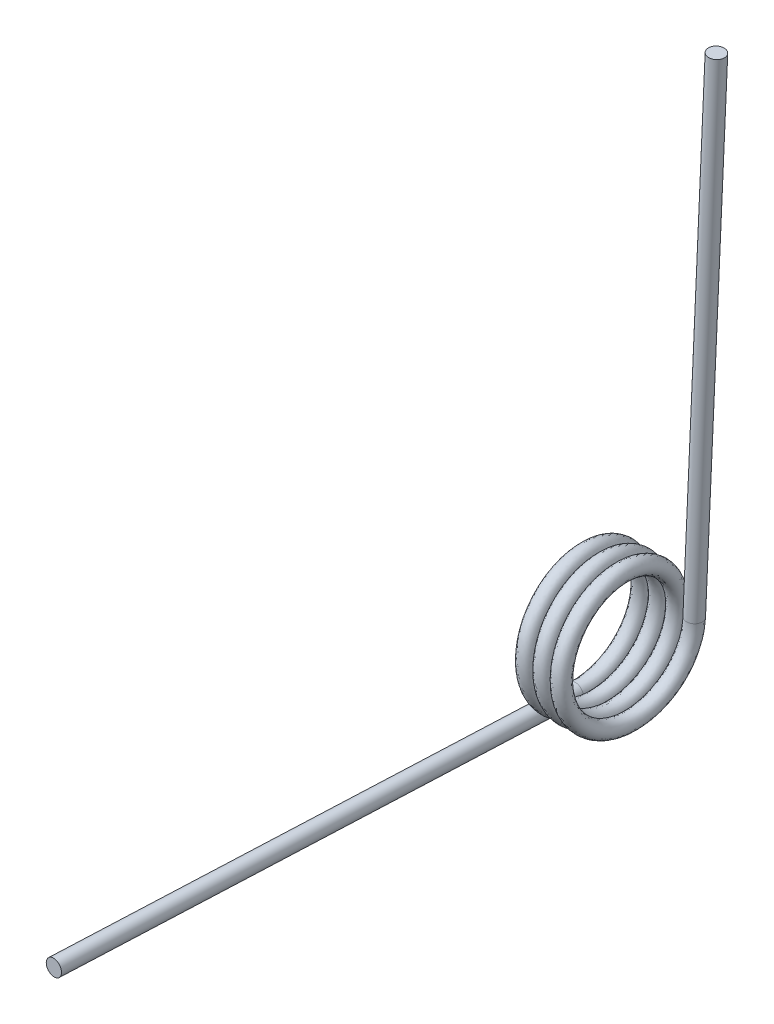
ISO-10303-21;
HEADER;
FILE_DESCRIPTION(('STEP AP214'),'2;1');
FILE_NAME('part.step','',(''),(''),'','','');
FILE_SCHEMA(('AUTOMOTIVE_DESIGN { 1 0 10303 214 1 1 1 1 }'));
ENDSEC;
DATA;
#1=APPLICATION_CONTEXT('core data for automotive mechanical design processes');
#2=APPLICATION_PROTOCOL_DEFINITION('international standard','automotive_design',2000,#1);
#3=PRODUCT_CONTEXT('',#1,'mechanical');
#4=PRODUCT('Part','Part','',(#3));
#5=PRODUCT_RELATED_PRODUCT_CATEGORY('part','',(#4));
#6=PRODUCT_DEFINITION_FORMATION('','',#4);
#7=PRODUCT_DEFINITION_CONTEXT('part definition',#1,'design');
#8=PRODUCT_DEFINITION('design','',#6,#7);
#9=PRODUCT_DEFINITION_SHAPE('','',#8);
#10=(LENGTH_UNIT() NAMED_UNIT(*) SI_UNIT(.MILLI.,.METRE.));
#11=(NAMED_UNIT(*) PLANE_ANGLE_UNIT() SI_UNIT($,.RADIAN.));
#12=(NAMED_UNIT(*) SI_UNIT($,.STERADIAN.) SOLID_ANGLE_UNIT());
#13=UNCERTAINTY_MEASURE_WITH_UNIT(LENGTH_MEASURE(1.E-05),#10,'distance_accuracy_value','');
#14=(GEOMETRIC_REPRESENTATION_CONTEXT(3) GLOBAL_UNCERTAINTY_ASSIGNED_CONTEXT((#13)) GLOBAL_UNIT_ASSIGNED_CONTEXT((#10,
#11,#12)) REPRESENTATION_CONTEXT('',''));
#15=CARTESIAN_POINT('',(0.,0.,0.));
#16=DIRECTION('',(0.,0.,1.));
#17=DIRECTION('',(1.,0.,0.));
#18=AXIS2_PLACEMENT_3D('',#15,#16,#17);
#19=CARTESIAN_POINT('',(-0.152249362965953,-1.1811,-0.006774324797477));
#20=CARTESIAN_POINT('',(-0.124732696299286,-1.1771888417546,-0.688682727737344));
#21=CARTESIAN_POINT('',(-0.0972160296326196,-0.584683262631898,-1.02624976680854));
#22=CARTESIAN_POINT('',(-0.069699362965953,0.00782231649080252,-1.36381680587973));
#23=CARTESIAN_POINT('',(-0.0421826962992864,0.596416737368102,-1.01947544201106));
#24=CARTESIAN_POINT('',(-0.0146660296326198,1.1850111582454,-0.675134078142391));
#25=CARTESIAN_POINT('',(0.0128506370340468,1.1811,0.00677432479747685));
#26=CARTESIAN_POINT('',(0.0403673037007134,1.1771888417546,0.688682727737344));
#27=CARTESIAN_POINT('',(0.06788397036738,0.584683262631899,1.02624976680854));
#28=CARTESIAN_POINT('',(0.0954006370340467,-0.00782231649080235,1.36381680587973));
#29=CARTESIAN_POINT('',(0.122917303700713,-0.596416737368101,1.01947544201106));
#30=CARTESIAN_POINT('',(0.15043397036738,-1.1850111582454,0.675134078142391));
#31=CARTESIAN_POINT('',(0.177950637034046,-1.1811,-0.006774324797477));
#32=CARTESIAN_POINT('',(0.205467303700713,-1.1771888417546,-0.688682727737344));
#33=CARTESIAN_POINT('',(0.23298397036738,-0.584683262631898,-1.02624976680854));
#34=CARTESIAN_POINT('',(0.260500637034046,0.00782231649080252,-1.36381680587973));
#35=CARTESIAN_POINT('',(0.288017303700713,0.596416737368102,-1.01947544201106));
#36=CARTESIAN_POINT('',(0.315533970367379,1.1850111582454,-0.675134078142391));
#37=CARTESIAN_POINT('',(0.343050637034046,1.1811,0.00677432479747685));
#38=CARTESIAN_POINT('',(0.370567303700713,1.1771888417546,0.688682727737344));
#39=CARTESIAN_POINT('',(0.398083970367379,0.584683262631899,1.02624976680854));
#40=CARTESIAN_POINT('',(0.425600637034046,-0.00782231649080235,1.36381680587973));
#41=CARTESIAN_POINT('',(0.453117303700712,-0.596416737368101,1.01947544201106));
#42=CARTESIAN_POINT('',(0.480633970367379,-1.1850111582454,0.675134078142391));
#43=CARTESIAN_POINT('',(0.508150637034046,-1.1811,-0.006774324797477));
#44=CARTESIAN_POINT('',(0.535667303700712,-1.1771888417546,-0.688682727737344));
#45=CARTESIAN_POINT('',(0.563183970367379,-0.584683262631898,-1.02624976680854));
#46=CARTESIAN_POINT('',(0.590700637034046,0.00782231649080252,-1.36381680587973));
#47=CARTESIAN_POINT('',(0.618217303700712,0.596416737368102,-1.01947544201106));
#48=CARTESIAN_POINT('',(0.645733970367379,1.1850111582454,-0.675134078142391));
#49=CARTESIAN_POINT('',(0.673250637034045,1.1811,0.00677432479747685));
#50=CARTESIAN_POINT('',(0.700767303700712,1.1771888417546,0.688682727737344));
#51=CARTESIAN_POINT('',(0.728283970367378,0.584683262631899,1.02624976680854));
#52=CARTESIAN_POINT('',(0.755800637034045,-0.00782231649080235,1.36381680587973));
#53=CARTESIAN_POINT('',(0.783317303700712,-0.596416737368101,1.01947544201106));
#54=CARTESIAN_POINT('',(0.810833970367378,-1.1850111582454,0.675134078142391));
#55=CARTESIAN_POINT('',(0.838350637034045,-1.1811,-0.006774324797477));
#56=CARTESIAN_POINT('',(0.865867303700712,-1.1771888417546,-0.688682727737344));
#57=CARTESIAN_POINT('',(0.893383970367378,-0.584683262631898,-1.02624976680854));
#58=CARTESIAN_POINT('',(0.920900637034045,0.00782231649080252,-1.36381680587973));
#59=CARTESIAN_POINT('',(0.948417303700711,0.596416737368102,-1.01947544201106));
#60=CARTESIAN_POINT('',(0.975933970367378,1.1850111582454,-0.675134078142391));
#61=CARTESIAN_POINT('',(1.00345063703404,1.1811,0.00677432479747685));
#62=CARTESIAN_POINT('',(1.03096730370071,1.1771888417546,0.688682727737344));
#63=CARTESIAN_POINT('',(1.05848397036738,0.584683262631899,1.02624976680854));
#64=CARTESIAN_POINT('',(1.08600063703404,-0.00782231649080235,1.36381680587973));
#65=CARTESIAN_POINT('',(1.11351730370071,-0.596416737368101,1.01947544201106));
#66=CARTESIAN_POINT('',(1.14103397036738,-1.1850111582454,0.675134078142391));
#67=CARTESIAN_POINT('',(1.16855063703404,-1.1811,-0.006774324797477));
#68=CARTESIAN_POINT('',(-0.152249362965953,-0.8763,-0.00677432479747363));
#69=CARTESIAN_POINT('',(-0.124732696299286,-0.872388841754601,-0.512706365688343));
#70=CARTESIAN_POINT('',(-0.0972160296326197,-0.432283262631901,-0.762285223735041));
#71=CARTESIAN_POINT('',(-0.0696993629659531,0.00782231649079865,-1.01186408178174));
#72=CARTESIAN_POINT('',(-0.0421826962992865,0.444016737368099,-0.755510898937567));
#73=CARTESIAN_POINT('',(-0.0146660296326199,0.8802111582454,-0.499157716093396));
#74=CARTESIAN_POINT('',(0.0128506370340467,0.8763,0.00677432479747352));
#75=CARTESIAN_POINT('',(0.0403673037007133,0.872388841754601,0.512706365688343));
#76=CARTESIAN_POINT('',(0.0678839703673799,0.432283262631902,0.762285223735041));
#77=CARTESIAN_POINT('',(0.0954006370340465,-0.00782231649079853,1.01186408178174));
#78=CARTESIAN_POINT('',(0.122917303700713,-0.444016737368099,0.755510898937568));
#79=CARTESIAN_POINT('',(0.15043397036738,-0.8802111582454,0.499157716093396));
#80=CARTESIAN_POINT('',(0.177950637034046,-0.8763,-0.00677432479747363));
#81=CARTESIAN_POINT('',(0.205467303700713,-0.872388841754601,-0.512706365688343));
#82=CARTESIAN_POINT('',(0.23298397036738,-0.432283262631901,-0.762285223735041));
#83=CARTESIAN_POINT('',(0.260500637034046,0.00782231649079865,-1.01186408178174));
#84=CARTESIAN_POINT('',(0.288017303700713,0.444016737368099,-0.755510898937567));
#85=CARTESIAN_POINT('',(0.315533970367379,0.8802111582454,-0.499157716093396));
#86=CARTESIAN_POINT('',(0.343050637034046,0.8763,0.00677432479747352));
#87=CARTESIAN_POINT('',(0.370567303700713,0.872388841754601,0.512706365688343));
#88=CARTESIAN_POINT('',(0.398083970367379,0.432283262631902,0.762285223735041));
#89=CARTESIAN_POINT('',(0.425600637034046,-0.00782231649079853,1.01186408178174));
#90=CARTESIAN_POINT('',(0.453117303700712,-0.444016737368099,0.755510898937568));
#91=CARTESIAN_POINT('',(0.480633970367379,-0.8802111582454,0.499157716093396));
#92=CARTESIAN_POINT('',(0.508150637034046,-0.8763,-0.00677432479747363));
#93=CARTESIAN_POINT('',(0.535667303700712,-0.872388841754601,-0.512706365688343));
#94=CARTESIAN_POINT('',(0.563183970367379,-0.432283262631901,-0.762285223735041));
#95=CARTESIAN_POINT('',(0.590700637034045,0.00782231649079865,-1.01186408178174));
#96=CARTESIAN_POINT('',(0.618217303700712,0.444016737368099,-0.755510898937567));
#97=CARTESIAN_POINT('',(0.645733970367379,0.8802111582454,-0.499157716093396));
#98=CARTESIAN_POINT('',(0.673250637034045,0.8763,0.00677432479747352));
#99=CARTESIAN_POINT('',(0.700767303700712,0.872388841754601,0.512706365688343));
#100=CARTESIAN_POINT('',(0.728283970367378,0.432283262631902,0.762285223735041));
#101=CARTESIAN_POINT('',(0.755800637034045,-0.00782231649079853,1.01186408178174));
#102=CARTESIAN_POINT('',(0.783317303700711,-0.444016737368099,0.755510898937568));
#103=CARTESIAN_POINT('',(0.810833970367378,-0.8802111582454,0.499157716093396));
#104=CARTESIAN_POINT('',(0.838350637034045,-0.8763,-0.00677432479747363));
#105=CARTESIAN_POINT('',(0.865867303700711,-0.872388841754601,-0.512706365688343));
#106=CARTESIAN_POINT('',(0.893383970367378,-0.432283262631901,-0.762285223735041));
#107=CARTESIAN_POINT('',(0.920900637034045,0.00782231649079865,-1.01186408178174));
#108=CARTESIAN_POINT('',(0.948417303700711,0.444016737368099,-0.755510898937567));
#109=CARTESIAN_POINT('',(0.975933970367378,0.8802111582454,-0.499157716093396));
#110=CARTESIAN_POINT('',(1.00345063703404,0.8763,0.00677432479747352));
#111=CARTESIAN_POINT('',(1.03096730370071,0.872388841754601,0.512706365688343));
#112=CARTESIAN_POINT('',(1.05848397036738,0.432283262631902,0.762285223735041));
#113=CARTESIAN_POINT('',(1.08600063703404,-0.00782231649079853,1.01186408178174));
#114=CARTESIAN_POINT('',(1.11351730370071,-0.444016737368099,0.755510898937568));
#115=CARTESIAN_POINT('',(1.14103397036738,-0.8802111582454,0.499157716093396));
#116=CARTESIAN_POINT('',(1.16855063703404,-0.8763,-0.00677432479747363));
#117=CARTESIAN_POINT('',(0.152249362965953,-0.8763,0.00677432479745563));
#118=CARTESIAN_POINT('',(0.179766029632619,-0.88021115824539,-0.499157716093414));
#119=CARTESIAN_POINT('',(0.207282696299286,-0.444016737368084,-0.755510898937576));
#120=CARTESIAN_POINT('',(0.234799362965953,-0.00782231649077799,-1.01186408178174));
#121=CARTESIAN_POINT('',(0.262316029632619,0.432283262631917,-0.762285223735032));
#122=CARTESIAN_POINT('',(0.289832696299286,0.872388841754611,-0.512706365688325));
#123=CARTESIAN_POINT('',(0.317349362965952,0.8763,-0.00677432479745574));
#124=CARTESIAN_POINT('',(0.344866029632619,0.88021115824539,0.499157716093413));
#125=CARTESIAN_POINT('',(0.372382696299286,0.444016737368084,0.755510898937576));
#126=CARTESIAN_POINT('',(0.399899362965952,0.00782231649077812,1.01186408178174));
#127=CARTESIAN_POINT('',(0.427416029632619,-0.432283262631916,0.762285223735032));
#128=CARTESIAN_POINT('',(0.454932696299285,-0.872388841754611,0.512706365688326));
#129=CARTESIAN_POINT('',(0.482449362965952,-0.8763,0.00677432479745563));
#130=CARTESIAN_POINT('',(0.509966029632619,-0.88021115824539,-0.499157716093414));
#131=CARTESIAN_POINT('',(0.537482696299285,-0.444016737368084,-0.755510898937576));
#132=CARTESIAN_POINT('',(0.564999362965952,-0.00782231649077799,-1.01186408178174));
#133=CARTESIAN_POINT('',(0.592516029632618,0.432283262631917,-0.762285223735032));
#134=CARTESIAN_POINT('',(0.620032696299285,0.872388841754611,-0.512706365688325));
#135=CARTESIAN_POINT('',(0.647549362965952,0.8763,-0.00677432479745574));
#136=CARTESIAN_POINT('',(0.675066029632618,0.88021115824539,0.499157716093413));
#137=CARTESIAN_POINT('',(0.702582696299285,0.444016737368084,0.755510898937576));
#138=CARTESIAN_POINT('',(0.730099362965951,0.00782231649077812,1.01186408178174));
#139=CARTESIAN_POINT('',(0.757616029632618,-0.432283262631916,0.762285223735032));
#140=CARTESIAN_POINT('',(0.785132696299285,-0.872388841754611,0.512706365688326));
#141=CARTESIAN_POINT('',(0.812649362965951,-0.8763,0.00677432479745563));
#142=CARTESIAN_POINT('',(0.840166029632618,-0.88021115824539,-0.499157716093414));
#143=CARTESIAN_POINT('',(0.867682696299284,-0.444016737368084,-0.755510898937576));
#144=CARTESIAN_POINT('',(0.895199362965951,-0.00782231649077799,-1.01186408178174));
#145=CARTESIAN_POINT('',(0.922716029632617,0.432283262631917,-0.762285223735032));
#146=CARTESIAN_POINT('',(0.950232696299284,0.872388841754611,-0.512706365688325));
#147=CARTESIAN_POINT('',(0.977749362965951,0.8763,-0.00677432479745574));
#148=CARTESIAN_POINT('',(1.00526602963262,0.88021115824539,0.499157716093413));
#149=CARTESIAN_POINT('',(1.03278269629928,0.444016737368084,0.755510898937576));
#150=CARTESIAN_POINT('',(1.06029936296595,0.00782231649077812,1.01186408178174));
#151=CARTESIAN_POINT('',(1.08781602963262,-0.432283262631916,0.762285223735032));
#152=CARTESIAN_POINT('',(1.11533269629928,-0.872388841754611,0.512706365688326));
#153=CARTESIAN_POINT('',(1.14284936296595,-0.8763,0.00677432479745563));
#154=CARTESIAN_POINT('',(1.17036602963262,-0.88021115824539,-0.499157716093414));
#155=CARTESIAN_POINT('',(1.19788269629928,-0.444016737368084,-0.755510898937576));
#156=CARTESIAN_POINT('',(1.22539936296595,-0.00782231649077799,-1.01186408178174));
#157=CARTESIAN_POINT('',(1.25291602963262,0.432283262631917,-0.762285223735032));
#158=CARTESIAN_POINT('',(1.28043269629928,0.872388841754611,-0.512706365688325));
#159=CARTESIAN_POINT('',(1.30794936296595,0.8763,-0.00677432479745574));
#160=CARTESIAN_POINT('',(1.33546602963262,0.88021115824539,0.499157716093413));
#161=CARTESIAN_POINT('',(1.36298269629928,0.444016737368084,0.755510898937576));
#162=CARTESIAN_POINT('',(1.39049936296595,0.00782231649077812,1.01186408178174));
#163=CARTESIAN_POINT('',(1.41801602963262,-0.432283262631916,0.762285223735032));
#164=CARTESIAN_POINT('',(1.44553269629928,-0.872388841754611,0.512706365688326));
#165=CARTESIAN_POINT('',(1.47304936296595,-0.8763,0.00677432479745563));
#166=CARTESIAN_POINT('',(0.152249362965953,-1.1811,0.00677432479745226));
#167=CARTESIAN_POINT('',(0.17976602963262,-1.18501115824539,-0.675134078142415));
#168=CARTESIAN_POINT('',(0.207282696299286,-0.596416737368081,-1.01947544201107));
#169=CARTESIAN_POINT('',(0.234799362965953,-0.00782231649077412,-1.36381680587973));
#170=CARTESIAN_POINT('',(0.262316029632619,0.584683262631919,-1.02624976680853));
#171=CARTESIAN_POINT('',(0.289832696299286,1.17718884175461,-0.68868272773732));
#172=CARTESIAN_POINT('',(0.317349362965953,1.1811,-0.00677432479745241));
#173=CARTESIAN_POINT('',(0.344866029632619,1.18501115824539,0.675134078142414));
#174=CARTESIAN_POINT('',(0.372382696299286,0.596416737368081,1.01947544201107));
#175=CARTESIAN_POINT('',(0.399899362965952,0.00782231649077429,1.36381680587973));
#176=CARTESIAN_POINT('',(0.427416029632619,-0.584683262631919,1.02624976680853));
#177=CARTESIAN_POINT('',(0.454932696299286,-1.17718884175461,0.68868272773732));
#178=CARTESIAN_POINT('',(0.482449362965952,-1.1811,0.00677432479745226));
#179=CARTESIAN_POINT('',(0.509966029632619,-1.18501115824539,-0.675134078142415));
#180=CARTESIAN_POINT('',(0.537482696299285,-0.596416737368081,-1.01947544201107));
#181=CARTESIAN_POINT('',(0.564999362965952,-0.00782231649077412,-1.36381680587973));
#182=CARTESIAN_POINT('',(0.592516029632619,0.584683262631919,-1.02624976680853));
#183=CARTESIAN_POINT('',(0.620032696299285,1.17718884175461,-0.68868272773732));
#184=CARTESIAN_POINT('',(0.647549362965952,1.1811,-0.00677432479745241));
#185=CARTESIAN_POINT('',(0.675066029632618,1.18501115824539,0.675134078142414));
#186=CARTESIAN_POINT('',(0.702582696299285,0.596416737368081,1.01947544201107));
#187=CARTESIAN_POINT('',(0.730099362965952,0.00782231649077429,1.36381680587973));
#188=CARTESIAN_POINT('',(0.757616029632618,-0.584683262631919,1.02624976680853));
#189=CARTESIAN_POINT('',(0.785132696299285,-1.17718884175461,0.68868272773732));
#190=CARTESIAN_POINT('',(0.812649362965951,-1.1811,0.00677432479745226));
#191=CARTESIAN_POINT('',(0.840166029632618,-1.18501115824539,-0.675134078142415));
#192=CARTESIAN_POINT('',(0.867682696299285,-0.596416737368081,-1.01947544201107));
#193=CARTESIAN_POINT('',(0.895199362965951,-0.00782231649077412,-1.36381680587973));
#194=CARTESIAN_POINT('',(0.922716029632618,0.584683262631919,-1.02624976680853));
#195=CARTESIAN_POINT('',(0.950232696299284,1.17718884175461,-0.68868272773732));
#196=CARTESIAN_POINT('',(0.977749362965951,1.1811,-0.00677432479745241));
#197=CARTESIAN_POINT('',(1.00526602963262,1.18501115824539,0.675134078142414));
#198=CARTESIAN_POINT('',(1.03278269629928,0.596416737368081,1.01947544201107));
#199=CARTESIAN_POINT('',(1.06029936296595,0.00782231649077429,1.36381680587973));
#200=CARTESIAN_POINT('',(1.08781602963262,-0.584683262631919,1.02624976680853));
#201=CARTESIAN_POINT('',(1.11533269629928,-1.17718884175461,0.68868272773732));
#202=CARTESIAN_POINT('',(1.14284936296595,-1.1811,0.00677432479745226));
#203=CARTESIAN_POINT('',(1.17036602963262,-1.18501115824539,-0.675134078142415));
#204=CARTESIAN_POINT('',(1.19788269629928,-0.596416737368081,-1.01947544201107));
#205=CARTESIAN_POINT('',(1.22539936296595,-0.00782231649077412,-1.36381680587973));
#206=CARTESIAN_POINT('',(1.25291602963262,0.584683262631919,-1.02624976680853));
#207=CARTESIAN_POINT('',(1.28043269629928,1.17718884175461,-0.68868272773732));
#208=CARTESIAN_POINT('',(1.30794936296595,1.1811,-0.00677432479745241));
#209=CARTESIAN_POINT('',(1.33546602963262,1.18501115824539,0.675134078142414));
#210=CARTESIAN_POINT('',(1.36298269629928,0.596416737368081,1.01947544201107));
#211=CARTESIAN_POINT('',(1.39049936296595,0.00782231649077429,1.36381680587973));
#212=CARTESIAN_POINT('',(1.41801602963262,-0.584683262631919,1.02624976680853));
#213=CARTESIAN_POINT('',(1.44553269629928,-1.17718884175461,0.68868272773732));
#214=CARTESIAN_POINT('',(1.47304936296595,-1.1811,0.00677432479745226));
#215=CARTESIAN_POINT('',(0.152249362965953,-1.4859,0.00677432479744889));
#216=CARTESIAN_POINT('',(0.17976602963262,-1.48981115824539,-0.851110440191416));
#217=CARTESIAN_POINT('',(0.207282696299286,-0.748816737368078,-1.28343998508457));
#218=CARTESIAN_POINT('',(0.234799362965953,-0.00782231649077026,-1.71576952997773));
#219=CARTESIAN_POINT('',(0.26231602963262,0.737083262631922,-1.29021430988202));
#220=CARTESIAN_POINT('',(0.289832696299286,1.48198884175461,-0.864659089786314));
#221=CARTESIAN_POINT('',(0.317349362965953,1.4859,-0.00677432479744908));
#222=CARTESIAN_POINT('',(0.344866029632619,1.48981115824539,0.851110440191416));
#223=CARTESIAN_POINT('',(0.372382696299286,0.748816737368078,1.28343998508457));
#224=CARTESIAN_POINT('',(0.399899362965953,0.00782231649077047,1.71576952997773));
#225=CARTESIAN_POINT('',(0.427416029632619,-0.737083262631921,1.29021430988202));
#226=CARTESIAN_POINT('',(0.454932696299286,-1.48198884175461,0.864659089786315));
#227=CARTESIAN_POINT('',(0.482449362965952,-1.4859,0.00677432479744889));
#228=CARTESIAN_POINT('',(0.509966029632619,-1.48981115824539,-0.851110440191416));
#229=CARTESIAN_POINT('',(0.537482696299286,-0.748816737368078,-1.28343998508457));
#230=CARTESIAN_POINT('',(0.564999362965952,-0.00782231649077026,-1.71576952997773));
#231=CARTESIAN_POINT('',(0.592516029632619,0.737083262631922,-1.29021430988202));
#232=CARTESIAN_POINT('',(0.620032696299285,1.48198884175461,-0.864659089786314));
#233=CARTESIAN_POINT('',(0.647549362965952,1.4859,-0.00677432479744908));
#234=CARTESIAN_POINT('',(0.675066029632619,1.48981115824539,0.851110440191416));
#235=CARTESIAN_POINT('',(0.702582696299285,0.748816737368078,1.28343998508457));
#236=CARTESIAN_POINT('',(0.730099362965952,0.00782231649077047,1.71576952997773));
#237=CARTESIAN_POINT('',(0.757616029632618,-0.737083262631921,1.29021430988202));
#238=CARTESIAN_POINT('',(0.785132696299285,-1.48198884175461,0.864659089786315));
#239=CARTESIAN_POINT('',(0.812649362965952,-1.4859,0.00677432479744889));
#240=CARTESIAN_POINT('',(0.840166029632618,-1.48981115824539,-0.851110440191416));
#241=CARTESIAN_POINT('',(0.867682696299285,-0.748816737368078,-1.28343998508457));
#242=CARTESIAN_POINT('',(0.895199362965951,-0.00782231649077026,-1.71576952997773));
#243=CARTESIAN_POINT('',(0.922716029632618,0.737083262631922,-1.29021430988202));
#244=CARTESIAN_POINT('',(0.950232696299284,1.48198884175461,-0.864659089786314));
#245=CARTESIAN_POINT('',(0.977749362965951,1.4859,-0.00677432479744908));
#246=CARTESIAN_POINT('',(1.00526602963262,1.48981115824539,0.851110440191416));
#247=CARTESIAN_POINT('',(1.03278269629928,0.748816737368078,1.28343998508457));
#248=CARTESIAN_POINT('',(1.06029936296595,0.00782231649077047,1.71576952997773));
#249=CARTESIAN_POINT('',(1.08781602963262,-0.737083262631921,1.29021430988202));
#250=CARTESIAN_POINT('',(1.11533269629928,-1.48198884175461,0.864659089786315));
#251=CARTESIAN_POINT('',(1.14284936296595,-1.4859,0.00677432479744889));
#252=CARTESIAN_POINT('',(1.17036602963262,-1.48981115824539,-0.851110440191416));
#253=CARTESIAN_POINT('',(1.19788269629928,-0.748816737368078,-1.28343998508457));
#254=CARTESIAN_POINT('',(1.22539936296595,-0.00782231649077026,-1.71576952997773));
#255=CARTESIAN_POINT('',(1.25291602963262,0.737083262631922,-1.29021430988202));
#256=CARTESIAN_POINT('',(1.28043269629928,1.48198884175461,-0.864659089786314));
#257=CARTESIAN_POINT('',(1.30794936296595,1.4859,-0.00677432479744908));
#258=CARTESIAN_POINT('',(1.33546602963262,1.48981115824539,0.851110440191416));
#259=CARTESIAN_POINT('',(1.36298269629928,0.748816737368078,1.28343998508457));
#260=CARTESIAN_POINT('',(1.39049936296595,0.00782231649077047,1.71576952997773));
#261=CARTESIAN_POINT('',(1.41801602963262,-0.737083262631921,1.29021430988202));
#262=CARTESIAN_POINT('',(1.44553269629928,-1.48198884175461,0.864659089786315));
#263=CARTESIAN_POINT('',(1.47304936296595,-1.4859,0.00677432479744889));
#264=CARTESIAN_POINT('',(-0.152249362965953,-1.4859,-0.00677432479748037));
#265=CARTESIAN_POINT('',(-0.124732696299286,-1.4819888417546,-0.864659089786345));
#266=CARTESIAN_POINT('',(-0.0972160296326194,-0.737083262631895,-1.29021430988204));
#267=CARTESIAN_POINT('',(-0.0696993629659528,0.00782231649080639,-1.71576952997773));
#268=CARTESIAN_POINT('',(-0.0421826962992862,0.748816737368105,-1.28343998508456));
#269=CARTESIAN_POINT('',(-0.0146660296326196,1.4898111582454,-0.851110440191385));
#270=CARTESIAN_POINT('',(0.012850637034047,1.4859,0.00677432479748019));
#271=CARTESIAN_POINT('',(0.0403673037007136,1.4819888417546,0.864659089786345));
#272=CARTESIAN_POINT('',(0.0678839703673802,0.737083262631896,1.29021430988204));
#273=CARTESIAN_POINT('',(0.0954006370340468,-0.00782231649080618,1.71576952997773));
#274=CARTESIAN_POINT('',(0.122917303700713,-0.748816737368104,1.28343998508456));
#275=CARTESIAN_POINT('',(0.15043397036738,-1.4898111582454,0.851110440191385));
#276=CARTESIAN_POINT('',(0.177950637034047,-1.4859,-0.00677432479748037));
#277=CARTESIAN_POINT('',(0.205467303700713,-1.4819888417546,-0.864659089786345));
#278=CARTESIAN_POINT('',(0.23298397036738,-0.737083262631895,-1.29021430988204));
#279=CARTESIAN_POINT('',(0.260500637034046,0.00782231649080639,-1.71576952997773));
#280=CARTESIAN_POINT('',(0.288017303700713,0.748816737368105,-1.28343998508456));
#281=CARTESIAN_POINT('',(0.31553397036738,1.4898111582454,-0.851110440191385));
#282=CARTESIAN_POINT('',(0.343050637034046,1.4859,0.00677432479748019));
#283=CARTESIAN_POINT('',(0.370567303700713,1.4819888417546,0.864659089786345));
#284=CARTESIAN_POINT('',(0.398083970367379,0.737083262631896,1.29021430988204));
#285=CARTESIAN_POINT('',(0.425600637034046,-0.00782231649080618,1.71576952997773));
#286=CARTESIAN_POINT('',(0.453117303700713,-0.748816737368104,1.28343998508456));
#287=CARTESIAN_POINT('',(0.480633970367379,-1.4898111582454,0.851110440191385));
#288=CARTESIAN_POINT('',(0.508150637034046,-1.4859,-0.00677432479748037));
#289=CARTESIAN_POINT('',(0.535667303700713,-1.4819888417546,-0.864659089786345));
#290=CARTESIAN_POINT('',(0.563183970367379,-0.737083262631895,-1.29021430988204));
#291=CARTESIAN_POINT('',(0.590700637034046,0.00782231649080639,-1.71576952997773));
#292=CARTESIAN_POINT('',(0.618217303700712,0.748816737368105,-1.28343998508456));
#293=CARTESIAN_POINT('',(0.645733970367379,1.4898111582454,-0.851110440191385));
#294=CARTESIAN_POINT('',(0.673250637034046,1.4859,0.00677432479748019));
#295=CARTESIAN_POINT('',(0.700767303700712,1.4819888417546,0.864659089786345));
#296=CARTESIAN_POINT('',(0.728283970367379,0.737083262631896,1.29021430988204));
#297=CARTESIAN_POINT('',(0.755800637034045,-0.00782231649080618,1.71576952997773));
#298=CARTESIAN_POINT('',(0.783317303700712,-0.748816737368104,1.28343998508456));
#299=CARTESIAN_POINT('',(0.810833970367378,-1.4898111582454,0.851110440191385));
#300=CARTESIAN_POINT('',(0.838350637034045,-1.4859,-0.00677432479748037));
#301=CARTESIAN_POINT('',(0.865867303700712,-1.4819888417546,-0.864659089786345));
#302=CARTESIAN_POINT('',(0.893383970367378,-0.737083262631895,-1.29021430988204));
#303=CARTESIAN_POINT('',(0.920900637034045,0.00782231649080639,-1.71576952997773));
#304=CARTESIAN_POINT('',(0.948417303700712,0.748816737368105,-1.28343998508456));
#305=CARTESIAN_POINT('',(0.975933970367378,1.4898111582454,-0.851110440191385));
#306=CARTESIAN_POINT('',(1.00345063703404,1.4859,0.00677432479748019));
#307=CARTESIAN_POINT('',(1.03096730370071,1.4819888417546,0.864659089786345));
#308=CARTESIAN_POINT('',(1.05848397036738,0.737083262631896,1.29021430988204));
#309=CARTESIAN_POINT('',(1.08600063703404,-0.00782231649080618,1.71576952997773));
#310=CARTESIAN_POINT('',(1.11351730370071,-0.748816737368104,1.28343998508456));
#311=CARTESIAN_POINT('',(1.14103397036738,-1.4898111582454,0.851110440191385));
#312=CARTESIAN_POINT('',(1.16855063703404,-1.4859,-0.00677432479748037));
#313=CARTESIAN_POINT('',(-0.152249362965953,-1.1811,-0.006774324797477));
#314=CARTESIAN_POINT('',(-0.124732696299286,-1.1771888417546,-0.688682727737344));
#315=CARTESIAN_POINT('',(-0.0972160296326196,-0.584683262631898,-1.02624976680854));
#316=CARTESIAN_POINT('',(-0.069699362965953,0.00782231649080252,-1.36381680587973));
#317=CARTESIAN_POINT('',(-0.0421826962992864,0.596416737368102,-1.01947544201106));
#318=CARTESIAN_POINT('',(-0.0146660296326198,1.1850111582454,-0.675134078142391));
#319=CARTESIAN_POINT('',(0.0128506370340468,1.1811,0.00677432479747685));
#320=CARTESIAN_POINT('',(0.0403673037007134,1.1771888417546,0.688682727737344));
#321=CARTESIAN_POINT('',(0.06788397036738,0.584683262631899,1.02624976680854));
#322=CARTESIAN_POINT('',(0.0954006370340467,-0.00782231649080235,1.36381680587973));
#323=CARTESIAN_POINT('',(0.122917303700713,-0.596416737368101,1.01947544201106));
#324=CARTESIAN_POINT('',(0.15043397036738,-1.1850111582454,0.675134078142391));
#325=CARTESIAN_POINT('',(0.177950637034046,-1.1811,-0.006774324797477));
#326=CARTESIAN_POINT('',(0.205467303700713,-1.1771888417546,-0.688682727737344));
#327=CARTESIAN_POINT('',(0.23298397036738,-0.584683262631898,-1.02624976680854));
#328=CARTESIAN_POINT('',(0.260500637034046,0.00782231649080252,-1.36381680587973));
#329=CARTESIAN_POINT('',(0.288017303700713,0.596416737368102,-1.01947544201106));
#330=CARTESIAN_POINT('',(0.315533970367379,1.1850111582454,-0.675134078142391));
#331=CARTESIAN_POINT('',(0.343050637034046,1.1811,0.00677432479747685));
#332=CARTESIAN_POINT('',(0.370567303700713,1.1771888417546,0.688682727737344));
#333=CARTESIAN_POINT('',(0.398083970367379,0.584683262631899,1.02624976680854));
#334=CARTESIAN_POINT('',(0.425600637034046,-0.00782231649080235,1.36381680587973));
#335=CARTESIAN_POINT('',(0.453117303700712,-0.596416737368101,1.01947544201106));
#336=CARTESIAN_POINT('',(0.480633970367379,-1.1850111582454,0.675134078142391));
#337=CARTESIAN_POINT('',(0.508150637034046,-1.1811,-0.006774324797477));
#338=CARTESIAN_POINT('',(0.535667303700712,-1.1771888417546,-0.688682727737344));
#339=CARTESIAN_POINT('',(0.563183970367379,-0.584683262631898,-1.02624976680854));
#340=CARTESIAN_POINT('',(0.590700637034046,0.00782231649080252,-1.36381680587973));
#341=CARTESIAN_POINT('',(0.618217303700712,0.596416737368102,-1.01947544201106));
#342=CARTESIAN_POINT('',(0.645733970367379,1.1850111582454,-0.675134078142391));
#343=CARTESIAN_POINT('',(0.673250637034045,1.1811,0.00677432479747685));
#344=CARTESIAN_POINT('',(0.700767303700712,1.1771888417546,0.688682727737344));
#345=CARTESIAN_POINT('',(0.728283970367378,0.584683262631899,1.02624976680854));
#346=CARTESIAN_POINT('',(0.755800637034045,-0.00782231649080235,1.36381680587973));
#347=CARTESIAN_POINT('',(0.783317303700712,-0.596416737368101,1.01947544201106));
#348=CARTESIAN_POINT('',(0.810833970367378,-1.1850111582454,0.675134078142391));
#349=CARTESIAN_POINT('',(0.838350637034045,-1.1811,-0.006774324797477));
#350=CARTESIAN_POINT('',(0.865867303700712,-1.1771888417546,-0.688682727737344));
#351=CARTESIAN_POINT('',(0.893383970367378,-0.584683262631898,-1.02624976680854));
#352=CARTESIAN_POINT('',(0.920900637034045,0.00782231649080252,-1.36381680587973));
#353=CARTESIAN_POINT('',(0.948417303700711,0.596416737368102,-1.01947544201106));
#354=CARTESIAN_POINT('',(0.975933970367378,1.1850111582454,-0.675134078142391));
#355=CARTESIAN_POINT('',(1.00345063703404,1.1811,0.00677432479747685));
#356=CARTESIAN_POINT('',(1.03096730370071,1.1771888417546,0.688682727737344));
#357=CARTESIAN_POINT('',(1.05848397036738,0.584683262631899,1.02624976680854));
#358=CARTESIAN_POINT('',(1.08600063703404,-0.00782231649080235,1.36381680587973));
#359=CARTESIAN_POINT('',(1.11351730370071,-0.596416737368101,1.01947544201106));
#360=CARTESIAN_POINT('',(1.14103397036738,-1.1850111582454,0.675134078142391));
#361=CARTESIAN_POINT('',(1.16855063703404,-1.1811,-0.006774324797477));
#362=(BOUNDED_SURFACE() B_SPLINE_SURFACE(3,2,((#19,#20,#21,#22,#23,#24,#25,#26,#27,#28,#29,#30,
#31,#32,#33,#34,#35,#36,#37,#38,#39,#40,#41,#42,#43,#44,#45,#46,#47,#48,#49,#50,#51,#52,#53,#54,
#55,#56,#57,#58,#59,#60,#61,#62,#63,#64,#65,#66,#67),(#68,#69,#70,#71,#72,#73,#74,#75,#76,#77,
#78,#79,#80,#81,#82,#83,#84,#85,#86,#87,#88,#89,#90,#91,#92,#93,#94,#95,#96,#97,#98,#99,#100,
#101,#102,#103,#104,#105,#106,#107,#108,#109,#110,#111,#112,#113,#114,#115,#116),(#117,#118,
#119,#120,#121,#122,#123,#124,#125,#126,#127,#128,#129,#130,#131,#132,#133,#134,#135,#136,#137,
#138,#139,#140,#141,#142,#143,#144,#145,#146,#147,#148,#149,#150,#151,#152,#153,#154,#155,#156,
#157,#158,#159,#160,#161,#162,#163,#164,#165),(#166,#167,#168,#169,#170,#171,#172,#173,#174,
#175,#176,#177,#178,#179,#180,#181,#182,#183,#184,#185,#186,#187,#188,#189,#190,#191,#192,#193,
#194,#195,#196,#197,#198,#199,#200,#201,#202,#203,#204,#205,#206,#207,#208,#209,#210,#211,#212,
#213,#214),(#215,#216,#217,#218,#219,#220,#221,#222,#223,#224,#225,#226,#227,#228,#229,#230,
#231,#232,#233,#234,#235,#236,#237,#238,#239,#240,#241,#242,#243,#244,#245,#246,#247,#248,#249,
#250,#251,#252,#253,#254,#255,#256,#257,#258,#259,#260,#261,#262,#263),(#264,#265,#266,#267,
#268,#269,#270,#271,#272,#273,#274,#275,#276,#277,#278,#279,#280,#281,#282,#283,#284,#285,#286,
#287,#288,#289,#290,#291,#292,#293,#294,#295,#296,#297,#298,#299,#300,#301,#302,#303,#304,#305,
#306,#307,#308,#309,#310,#311,#312),(#313,#314,#315,#316,#317,#318,#319,#320,#321,#322,#323,
#324,#325,#326,#327,#328,#329,#330,#331,#332,#333,#334,#335,#336,#337,#338,#339,#340,#341,#342,
#343,#344,#345,#346,#347,#348,#349,#350,#351,#352,#353,#354,#355,#356,#357,#358,#359,#360,
#361)),.UNSPECIFIED.,.T.,.F.,.F.) B_SPLINE_SURFACE_WITH_KNOTS((4,3,4),(3,2,2,2,2,2,2,2,2,2,2,2,
2,2,2,2,2,2,2,2,2,2,2,2,3),(0.,0.5,1.),(0.,0.0416666666666667,0.0833333333333333,0.125,
0.166666666666667,0.208333333333333,0.25,0.291666666666667,0.333333333333333,0.375,
0.416666666666667,0.458333333333333,0.5,0.541666666666667,0.583333333333333,0.625,
0.666666666666667,0.708333333333333,0.75,0.791666666666667,0.833333333333333,0.875,
0.916666666666667,0.958333333333333,1.),
.UNSPECIFIED.) GEOMETRIC_REPRESENTATION_ITEM() RATIONAL_B_SPLINE_SURFACE(((1.,0.866025403784439,
1.,0.866025403784439,1.,0.866025403784439,1.,0.866025403784439,1.,0.866025403784439,1.,
0.866025403784439,1.,0.866025403784439,1.,0.866025403784439,1.,0.866025403784439,1.,
0.866025403784439,1.,0.866025403784439,1.,0.866025403784439,1.,0.866025403784439,1.,
0.866025403784439,1.,0.866025403784439,1.,0.866025403784439,1.,0.866025403784439,1.,
0.866025403784439,1.,0.866025403784439,1.,0.866025403784439,1.,0.866025403784439,1.,
0.866025403784439,1.,0.866025403784439,1.,0.866025403784439,1.),(0.333333333333333,
0.288675134594813,0.333333333333333,0.288675134594813,0.333333333333333,0.288675134594813,
0.333333333333333,0.288675134594813,0.333333333333333,0.288675134594813,0.333333333333333,
0.288675134594813,0.333333333333333,0.288675134594813,0.333333333333333,0.288675134594813,
0.333333333333333,0.288675134594813,0.333333333333333,0.288675134594813,0.333333333333333,
0.288675134594813,0.333333333333333,0.288675134594813,0.333333333333333,0.288675134594813,
0.333333333333333,0.288675134594813,0.333333333333333,0.288675134594813,0.333333333333333,
0.288675134594813,0.333333333333333,0.288675134594813,0.333333333333333,0.288675134594813,
0.333333333333333,0.288675134594813,0.333333333333333,0.288675134594813,0.333333333333333,
0.288675134594813,0.333333333333333,0.288675134594813,0.333333333333333,0.288675134594813,
0.333333333333333,0.288675134594813,0.333333333333333),(0.333333333333333,0.288675134594813,
0.333333333333333,0.288675134594813,0.333333333333333,0.288675134594813,0.333333333333333,
0.288675134594813,0.333333333333333,0.288675134594813,0.333333333333333,0.288675134594813,
0.333333333333333,0.288675134594813,0.333333333333333,0.288675134594813,0.333333333333333,
0.288675134594813,0.333333333333333,0.288675134594813,0.333333333333333,0.288675134594813,
0.333333333333333,0.288675134594813,0.333333333333333,0.288675134594813,0.333333333333333,
0.288675134594813,0.333333333333333,0.288675134594813,0.333333333333333,0.288675134594813,
0.333333333333333,0.288675134594813,0.333333333333333,0.288675134594813,0.333333333333333,
0.288675134594813,0.333333333333333,0.288675134594813,0.333333333333333,0.288675134594813,
0.333333333333333,0.288675134594813,0.333333333333333,0.288675134594813,0.333333333333333,
0.288675134594813,0.333333333333333),(1.,0.866025403784439,1.,0.866025403784439,1.,
0.866025403784439,1.,0.866025403784439,1.,0.866025403784439,1.,0.866025403784439,1.,
0.866025403784439,1.,0.866025403784439,1.,0.866025403784439,1.,0.866025403784439,1.,
0.866025403784439,1.,0.866025403784439,1.,0.866025403784439,1.,0.866025403784439,1.,
0.866025403784439,1.,0.866025403784439,1.,0.866025403784439,1.,0.866025403784439,1.,
0.866025403784439,1.,0.866025403784439,1.,0.866025403784439,1.,0.866025403784439,1.,
0.866025403784439,1.,0.866025403784439,1.),(0.333333333333333,0.288675134594813,
0.333333333333333,0.288675134594813,0.333333333333333,0.288675134594813,0.333333333333333,
0.288675134594813,0.333333333333333,0.288675134594813,0.333333333333333,0.288675134594813,
0.333333333333333,0.288675134594813,0.333333333333333,0.288675134594813,0.333333333333333,
0.288675134594813,0.333333333333333,0.288675134594813,0.333333333333333,0.288675134594813,
0.333333333333333,0.288675134594813,0.333333333333333,0.288675134594813,0.333333333333333,
0.288675134594813,0.333333333333333,0.288675134594813,0.333333333333333,0.288675134594813,
0.333333333333333,0.288675134594813,0.333333333333333,0.288675134594813,0.333333333333333,
0.288675134594813,0.333333333333333,0.288675134594813,0.333333333333333,0.288675134594813,
0.333333333333333,0.288675134594813,0.333333333333333,0.288675134594813,0.333333333333333,
0.288675134594813,0.333333333333333),(0.333333333333333,0.288675134594813,0.333333333333333,
0.288675134594813,0.333333333333333,0.288675134594813,0.333333333333333,0.288675134594813,
0.333333333333333,0.288675134594813,0.333333333333333,0.288675134594813,0.333333333333333,
0.288675134594813,0.333333333333333,0.288675134594813,0.333333333333333,0.288675134594813,
0.333333333333333,0.288675134594813,0.333333333333333,0.288675134594813,0.333333333333333,
0.288675134594813,0.333333333333333,0.288675134594813,0.333333333333333,0.288675134594813,
0.333333333333333,0.288675134594813,0.333333333333333,0.288675134594813,0.333333333333333,
0.288675134594813,0.333333333333333,0.288675134594813,0.333333333333333,0.288675134594813,
0.333333333333333,0.288675134594813,0.333333333333333,0.288675134594813,0.333333333333333,
0.288675134594813,0.333333333333333,0.288675134594813,0.333333333333333,0.288675134594813,
0.333333333333333),(1.,0.866025403784439,1.,0.866025403784439,1.,0.866025403784439,1.,
0.866025403784439,1.,0.866025403784439,1.,0.866025403784439,1.,0.866025403784439,1.,
0.866025403784439,1.,0.866025403784439,1.,0.866025403784439,1.,0.866025403784439,1.,
0.866025403784439,1.,0.866025403784439,1.,0.866025403784439,1.,0.866025403784439,1.,
0.866025403784439,1.,0.866025403784439,1.,0.866025403784439,1.,0.866025403784439,1.,
0.866025403784439,1.,0.866025403784439,1.,0.866025403784439,1.,0.866025403784439,1.,
0.866025403784439,1.))) REPRESENTATION_ITEM('') SURFACE());
#363=CARTESIAN_POINT('',(1.07315,0.,-1.1811));
#364=DIRECTION('',(0.0444509501145973,0.999011568018063,0.));
#365=DIRECTION('',(-0.999011568018063,0.0444509501145973,0.));
#366=AXIS2_PLACEMENT_3D('',#363,#364,#365);
#367=CIRCLE('',#366,0.1524);
#368=CARTESIAN_POINT('',(0.920900637034047,0.00677432479752851,-1.1811));
#369=VERTEX_POINT('',#368);
#370=EDGE_CURVE('E10',#369,#369,#367,.T.);
#371=CARTESIAN_POINT('',(0.,-1.1811,0.));
#372=DIRECTION('',(0.0444509501145973,0.,-0.999011568018063));
#373=DIRECTION('',(-0.999011568018063,0.,-0.0444509501145973));
#374=AXIS2_PLACEMENT_3D('',#371,#372,#373);
#375=CIRCLE('',#374,0.1524);
#376=CARTESIAN_POINT('',(-0.152249362965953,-1.1811,-0.006774324797477));
#377=VERTEX_POINT('',#376);
#378=EDGE_CURVE('E38',#377,#377,#375,.T.);
#379=ORIENTED_EDGE('',*,*,#370,.F.);
#380=EDGE_LOOP('',(#379));
#381=FACE_BOUND('',#380,.T.);
#382=ORIENTED_EDGE('',*,*,#378,.T.);
#383=EDGE_LOOP('',(#382));
#384=FACE_BOUND('',#383,.T.);
#385=ADVANCED_FACE('F30',(#381,#384),#362,.T.);
#386=CARTESIAN_POINT('',(-0.423395299841539,-1.18110000000011,9.51558518537204));
#387=DIRECTION('',(0.0444509501145973,0.,-0.999011568018063));
#388=DIRECTION('',(-0.999011568018063,0.,-0.0444509501145973));
#389=AXIS2_PLACEMENT_3D('',#386,#387,#388);
#390=CYLINDRICAL_SURFACE('',#389,0.1524);
#391=CARTESIAN_POINT('',(-0.423395299841539,-1.18110000000011,9.51558518537204));
#392=DIRECTION('',(-0.0444509501145973,0.,0.999011568018063));
#393=DIRECTION('',(0.999011568018063,0.,0.0444509501145973));
#394=AXIS2_PLACEMENT_3D('',#391,#392,#393);
#395=CIRCLE('',#394,0.1524);
#396=CARTESIAN_POINT('',(-0.271145936875586,-1.18110000000011,9.5223595101695));
#397=VERTEX_POINT('',#396);
#398=EDGE_CURVE('E42',#397,#397,#395,.T.);
#399=ORIENTED_EDGE('',*,*,#398,.F.);
#400=EDGE_LOOP('',(#399));
#401=FACE_BOUND('',#400,.T.);
#402=ORIENTED_EDGE('',*,*,#378,.F.);
#403=EDGE_LOOP('',(#402));
#404=FACE_BOUND('',#403,.T.);
#405=ADVANCED_FACE('F63',(#401,#404),#390,.T.);
#406=CARTESIAN_POINT('',(-0.423395299841539,-1.18110000000011,9.51558518537204));
#407=DIRECTION('',(-0.0444509501145973,0.,0.999011568018063));
#408=DIRECTION('',(0.999011568018063,0.,0.0444509501145973));
#409=AXIS2_PLACEMENT_3D('',#406,#407,#408);
#410=PLANE('',#409);
#411=ORIENTED_EDGE('',*,*,#398,.T.);
#412=EDGE_LOOP('',(#411));
#413=FACE_BOUND('',#412,.T.);
#414=ADVANCED_FACE('F56',(#413),#410,.T.);
#415=CARTESIAN_POINT('',(1.49654529984154,9.51558518537212,-1.18109999999948));
#416=DIRECTION('',(-0.0444509501145973,-0.999011568018063,0.));
#417=DIRECTION('',(0.999011568018063,-0.0444509501145973,0.));
#418=AXIS2_PLACEMENT_3D('',#415,#416,#417);
#419=CYLINDRICAL_SURFACE('',#418,0.1524);
#420=CARTESIAN_POINT('',(1.49654529984154,9.51558518537212,-1.18109999999948));
#421=DIRECTION('',(0.0444509501145973,0.999011568018063,0.));
#422=DIRECTION('',(-0.999011568018063,0.0444509501145973,0.));
#423=AXIS2_PLACEMENT_3D('',#420,#421,#422);
#424=CIRCLE('',#423,0.1524);
#425=CARTESIAN_POINT('',(1.34429593687559,9.52235951016958,-1.18109999999948));
#426=VERTEX_POINT('',#425);
#427=EDGE_CURVE('E46',#426,#426,#424,.T.);
#428=ORIENTED_EDGE('',*,*,#427,.F.);
#429=EDGE_LOOP('',(#428));
#430=FACE_BOUND('',#429,.T.);
#431=ORIENTED_EDGE('',*,*,#370,.T.);
#432=EDGE_LOOP('',(#431));
#433=FACE_BOUND('',#432,.T.);
#434=ADVANCED_FACE('F54',(#430,#433),#419,.T.);
#435=CARTESIAN_POINT('',(1.49654529984154,9.51558518537212,-1.18109999999948));
#436=DIRECTION('',(0.0444509501145973,0.999011568018063,0.));
#437=DIRECTION('',(-0.999011568018063,0.0444509501145973,0.));
#438=AXIS2_PLACEMENT_3D('',#435,#436,#437);
#439=PLANE('',#438);
#440=ORIENTED_EDGE('',*,*,#427,.T.);
#441=EDGE_LOOP('',(#440));
#442=FACE_BOUND('',#441,.T.);
#443=ADVANCED_FACE('F52',(#442),#439,.T.);
#444=CLOSED_SHELL('',(#385,#405,#414,#434,#443));
#445=MANIFOLD_SOLID_BREP('B2',#444);
#446=ADVANCED_BREP_SHAPE_REPRESENTATION('',(#18,#445),#14);
#447=SHAPE_DEFINITION_REPRESENTATION(#9,#446);
ENDSEC;
END-ISO-10303-21;
